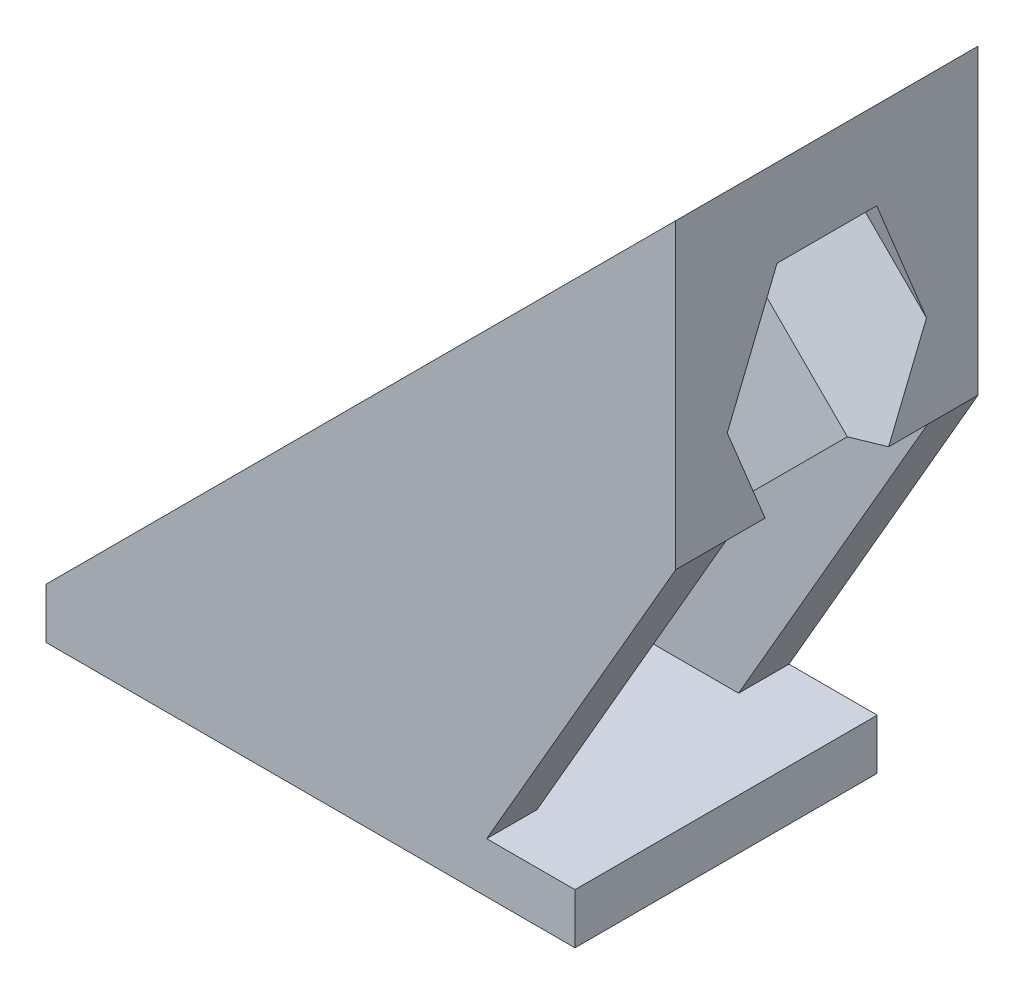
ISO-10303-21;
HEADER;
FILE_DESCRIPTION(('STEP AP214'),'2;1');
FILE_NAME('part.step','',(''),(''),'','','');
FILE_SCHEMA(('AUTOMOTIVE_DESIGN { 1 0 10303 214 1 1 1 1 }'));
ENDSEC;
DATA;
#1=APPLICATION_CONTEXT('core data for automotive mechanical design processes');
#2=APPLICATION_PROTOCOL_DEFINITION('international standard','automotive_design',2000,#1);
#3=PRODUCT_CONTEXT('',#1,'mechanical');
#4=PRODUCT('Part','Part','',(#3));
#5=PRODUCT_RELATED_PRODUCT_CATEGORY('part','',(#4));
#6=PRODUCT_DEFINITION_FORMATION('','',#4);
#7=PRODUCT_DEFINITION_CONTEXT('part definition',#1,'design');
#8=PRODUCT_DEFINITION('design','',#6,#7);
#9=PRODUCT_DEFINITION_SHAPE('','',#8);
#10=(LENGTH_UNIT() NAMED_UNIT(*) SI_UNIT(.MILLI.,.METRE.));
#11=(NAMED_UNIT(*) PLANE_ANGLE_UNIT() SI_UNIT($,.RADIAN.));
#12=(NAMED_UNIT(*) SI_UNIT($,.STERADIAN.) SOLID_ANGLE_UNIT());
#13=UNCERTAINTY_MEASURE_WITH_UNIT(LENGTH_MEASURE(1.E-05),#10,'distance_accuracy_value','');
#14=(GEOMETRIC_REPRESENTATION_CONTEXT(3) GLOBAL_UNCERTAINTY_ASSIGNED_CONTEXT((#13)) GLOBAL_UNIT_ASSIGNED_CONTEXT((#10,
#11,#12)) REPRESENTATION_CONTEXT('',''));
#15=CARTESIAN_POINT('',(0.,0.,0.));
#16=DIRECTION('',(0.,0.,1.));
#17=DIRECTION('',(1.,0.,0.));
#18=AXIS2_PLACEMENT_3D('',#15,#16,#17);
#19=CARTESIAN_POINT('',(0.,-2.,12.));
#20=DIRECTION('',(0.,1.,0.));
#21=DIRECTION('',(0.,0.,1.));
#22=AXIS2_PLACEMENT_3D('',#19,#20,#21);
#23=PLANE('',#22);
#24=CARTESIAN_POINT('',(10.2472232502674,-2.,6.));
#25=DIRECTION('',(0.,1.,0.));
#26=DIRECTION('',(0.,0.,1.));
#27=AXIS2_PLACEMENT_3D('',#24,#25,#26);
#28=CIRCLE('',#27,2.7);
#29=CARTESIAN_POINT('',(10.2472232502674,-2.,8.7));
#30=VERTEX_POINT('',#29);
#31=EDGE_CURVE('E228',#30,#30,#28,.T.);
#32=ORIENTED_EDGE('',*,*,#31,.T.);
#33=EDGE_LOOP('',(#32));
#34=FACE_BOUND('',#33,.T.);
#35=DIRECTION('',(1.,0.,0.));
#36=VECTOR('',#35,1.);
#37=CARTESIAN_POINT('',(0.,-2.,0.));
#38=LINE('',#37,#36);
#39=CARTESIAN_POINT('',(0.,-2.,0.));
#40=VERTEX_POINT('',#39);
#41=CARTESIAN_POINT('',(21.,-2.,0.));
#42=VERTEX_POINT('',#41);
#43=EDGE_CURVE('E241',#40,#42,#38,.T.);
#44=ORIENTED_EDGE('',*,*,#43,.T.);
#45=DIRECTION('',(0.,0.,-1.));
#46=VECTOR('',#45,1.);
#47=CARTESIAN_POINT('',(21.,-2.,12.));
#48=LINE('',#47,#46);
#49=CARTESIAN_POINT('',(21.,-2.,12.));
#50=VERTEX_POINT('',#49);
#51=EDGE_CURVE('E297',#50,#42,#48,.T.);
#52=ORIENTED_EDGE('',*,*,#51,.F.);
#53=DIRECTION('',(1.,0.,0.));
#54=VECTOR('',#53,1.);
#55=CARTESIAN_POINT('',(0.,-2.,12.));
#56=LINE('',#55,#54);
#57=CARTESIAN_POINT('',(0.,-2.,12.));
#58=VERTEX_POINT('',#57);
#59=EDGE_CURVE('E246',#58,#50,#56,.T.);
#60=ORIENTED_EDGE('',*,*,#59,.F.);
#61=DIRECTION('',(0.,0.,-1.));
#62=VECTOR('',#61,1.);
#63=CARTESIAN_POINT('',(0.,-2.,12.));
#64=LINE('',#63,#62);
#65=EDGE_CURVE('E268',#58,#40,#64,.T.);
#66=ORIENTED_EDGE('',*,*,#65,.T.);
#67=EDGE_LOOP('',(#44,#52,#60,#66));
#68=FACE_BOUND('',#67,.T.);
#69=ADVANCED_FACE('F44',(#34,#68),#23,.F.);
#70=CARTESIAN_POINT('',(20.,13.0000000000001,2.));
#71=DIRECTION('',(-0.607450107570799,0.794357832977195,0.));
#72=DIRECTION('',(-0.794357832977195,-0.607450107570799,0.));
#73=AXIS2_PLACEMENT_3D('',#70,#71,#72);
#74=PLANE('',#73);
#75=DIRECTION('',(-0.794357832977195,-0.607450107570799,0.));
#76=VECTOR('',#75,1.);
#77=CARTESIAN_POINT('',(20.,13.0000000000001,2.));
#78=LINE('',#77,#76);
#79=CARTESIAN_POINT('',(17.310833200471,10.943578329772,2.));
#80=VERTEX_POINT('',#79);
#81=CARTESIAN_POINT('',(2.99999999999997,0.,2.));
#82=VERTEX_POINT('',#81);
#83=EDGE_CURVE('E332',#80,#82,#78,.T.);
#84=ORIENTED_EDGE('',*,*,#83,.F.);
#85=DIRECTION('',(0.,0.,1.));
#86=VECTOR('',#85,1.);
#87=CARTESIAN_POINT('',(17.310833200471,10.943578329772,10.));
#88=LINE('',#87,#86);
#89=CARTESIAN_POINT('',(17.310833200471,10.943578329772,10.));
#90=VERTEX_POINT('',#89);
#91=EDGE_CURVE('E322',#80,#90,#88,.T.);
#92=ORIENTED_EDGE('',*,*,#91,.T.);
#93=DIRECTION('',(-0.794357832977195,-0.607450107570799,0.));
#94=VECTOR('',#93,1.);
#95=CARTESIAN_POINT('',(20.,13.0000000000001,10.));
#96=LINE('',#95,#94);
#97=CARTESIAN_POINT('',(2.99999999999997,0.,10.));
#98=VERTEX_POINT('',#97);
#99=EDGE_CURVE('E235',#90,#98,#96,.T.);
#100=ORIENTED_EDGE('',*,*,#99,.T.);
#101=DIRECTION('',(0.,0.,1.));
#102=VECTOR('',#101,1.);
#103=CARTESIAN_POINT('',(2.99999999999997,0.,2.));
#104=LINE('',#103,#102);
#105=EDGE_CURVE('E237',#82,#98,#104,.T.);
#106=ORIENTED_EDGE('',*,*,#105,.F.);
#107=EDGE_LOOP('',(#84,#92,#100,#106));
#108=FACE_BOUND('',#107,.T.);
#109=CARTESIAN_POINT('',(10.2472232502674,5.54199425020454,6.));
#110=DIRECTION('',(-0.607450107570799,0.794357832977195,0.));
#111=DIRECTION('',(-0.794357832977195,-0.607450107570799,0.));
#112=AXIS2_PLACEMENT_3D('',#109,#110,#111);
#113=ELLIPSE('',#112,6.29439251736257,5.);
#114=CARTESIAN_POINT('',(5.61538461538457,2.,7.88310139408547));
#115=VERTEX_POINT('',#114);
#116=CARTESIAN_POINT('',(5.61538461538457,2.,4.11689860591453));
#117=VERTEX_POINT('',#116);
#118=EDGE_CURVE('E365',#115,#117,#113,.F.);
#119=ORIENTED_EDGE('',*,*,#118,.F.);
#120=DIRECTION('',(0.,0.,-1.));
#121=VECTOR('',#120,1.);
#122=CARTESIAN_POINT('',(5.61538461538457,2.,2.));
#123=LINE('',#122,#121);
#124=EDGE_CURVE('E347',#115,#117,#123,.T.);
#125=ORIENTED_EDGE('',*,*,#124,.T.);
#126=EDGE_LOOP('',(#119,#125));
#127=FACE_BOUND('',#126,.T.);
#128=ADVANCED_FACE('F333',(#108,#127),#74,.F.);
#129=CARTESIAN_POINT('',(0.,0.,2.));
#130=DIRECTION('',(0.,0.,1.));
#131=DIRECTION('',(1.,0.,0.));
#132=AXIS2_PLACEMENT_3D('',#129,#130,#131);
#133=PLANE('',#132);
#134=DIRECTION('',(-1.,0.,0.));
#135=VECTOR('',#134,1.);
#136=CARTESIAN_POINT('',(25.,13.0000000000001,2.));
#137=LINE('',#136,#135);
#138=CARTESIAN_POINT('',(25.,13.0000000000001,2.));
#139=VERTEX_POINT('',#138);
#140=CARTESIAN_POINT('',(23.385334276179,13.0000000000001,2.));
#141=VERTEX_POINT('',#140);
#142=EDGE_CURVE('E405',#139,#141,#137,.T.);
#143=ORIENTED_EDGE('',*,*,#142,.T.);
#144=CARTESIAN_POINT('',(23.385334276179,3.00000000000009,2.));
#145=DIRECTION('',(0.,0.,1.));
#146=DIRECTION('',(1.,0.,0.));
#147=AXIS2_PLACEMENT_3D('',#144,#145,#146);
#148=CIRCLE('',#147,10.);
#149=EDGE_CURVE('E11',#141,#80,#148,.T.);
#150=ORIENTED_EDGE('',*,*,#149,.T.);
#151=ORIENTED_EDGE('',*,*,#83,.T.);
#152=DIRECTION('',(1.,0.,0.));
#153=VECTOR('',#152,1.);
#154=CARTESIAN_POINT('',(2.99999999999997,0.,2.));
#155=LINE('',#154,#153);
#156=CARTESIAN_POINT('',(7.24722325026741,0.,2.));
#157=VERTEX_POINT('',#156);
#158=EDGE_CURVE('E409',#82,#157,#155,.T.);
#159=ORIENTED_EDGE('',*,*,#158,.T.);
#160=DIRECTION('',(0.,-1.,0.));
#161=VECTOR('',#160,1.);
#162=CARTESIAN_POINT('',(7.24722325026741,2.,2.));
#163=LINE('',#162,#161);
#164=CARTESIAN_POINT('',(7.24722325026741,2.,2.));
#165=VERTEX_POINT('',#164);
#166=EDGE_CURVE('E359',#157,#165,#163,.F.);
#167=ORIENTED_EDGE('',*,*,#166,.T.);
#168=DIRECTION('',(-1.,0.,0.));
#169=VECTOR('',#168,1.);
#170=CARTESIAN_POINT('',(0.,2.,2.));
#171=LINE('',#170,#169);
#172=CARTESIAN_POINT('',(13.2472232502674,2.,2.));
#173=VERTEX_POINT('',#172);
#174=EDGE_CURVE('E349',#173,#165,#171,.T.);
#175=ORIENTED_EDGE('',*,*,#174,.F.);
#176=DIRECTION('',(0.,-1.,0.));
#177=VECTOR('',#176,1.);
#178=CARTESIAN_POINT('',(13.2472232502674,2.,2.));
#179=LINE('',#178,#177);
#180=CARTESIAN_POINT('',(13.2472232502674,0.,2.));
#181=VERTEX_POINT('',#180);
#182=EDGE_CURVE('E354',#173,#181,#179,.T.);
#183=ORIENTED_EDGE('',*,*,#182,.T.);
#184=CARTESIAN_POINT('',(17.4944465005349,0.,2.));
#185=VERTEX_POINT('',#184);
#186=EDGE_CURVE('E403',#181,#185,#155,.T.);
#187=ORIENTED_EDGE('',*,*,#186,.T.);
#188=DIRECTION('',(0.499999999999998,0.86602540378444,0.));
#189=VECTOR('',#188,1.);
#190=CARTESIAN_POINT('',(17.4944465005349,0.,2.));
#191=LINE('',#190,#189);
#192=EDGE_CURVE('E234',#185,#139,#191,.T.);
#193=ORIENTED_EDGE('',*,*,#192,.T.);
#194=EDGE_LOOP('',(#143,#150,#151,#159,#167,#175,#183,#187,#193));
#195=FACE_BOUND('',#194,.T.);
#196=ADVANCED_FACE('F411',(#195),#133,.T.);
#197=CARTESIAN_POINT('',(0.,0.,10.));
#198=DIRECTION('',(0.,0.,1.));
#199=DIRECTION('',(1.,0.,0.));
#200=AXIS2_PLACEMENT_3D('',#197,#198,#199);
#201=PLANE('',#200);
#202=ORIENTED_EDGE('',*,*,#99,.F.);
#203=CARTESIAN_POINT('',(23.385334276179,3.00000000000009,10.));
#204=DIRECTION('',(0.,0.,1.));
#205=DIRECTION('',(1.,0.,0.));
#206=AXIS2_PLACEMENT_3D('',#203,#204,#205);
#207=CIRCLE('',#206,10.);
#208=CARTESIAN_POINT('',(23.385334276179,13.0000000000001,10.));
#209=VERTEX_POINT('',#208);
#210=EDGE_CURVE('E66',#90,#209,#207,.F.);
#211=ORIENTED_EDGE('',*,*,#210,.T.);
#212=DIRECTION('',(-1.,0.,0.));
#213=VECTOR('',#212,1.);
#214=CARTESIAN_POINT('',(25.,13.0000000000001,10.));
#215=LINE('',#214,#213);
#216=CARTESIAN_POINT('',(25.,13.0000000000001,10.));
#217=VERTEX_POINT('',#216);
#218=EDGE_CURVE('E232',#217,#209,#215,.T.);
#219=ORIENTED_EDGE('',*,*,#218,.F.);
#220=DIRECTION('',(0.499999999999998,0.86602540378444,0.));
#221=VECTOR('',#220,1.);
#222=CARTESIAN_POINT('',(17.4944465005349,0.,10.));
#223=LINE('',#222,#221);
#224=CARTESIAN_POINT('',(17.4944465005349,0.,10.));
#225=VERTEX_POINT('',#224);
#226=EDGE_CURVE('E229',#225,#217,#223,.T.);
#227=ORIENTED_EDGE('',*,*,#226,.F.);
#228=DIRECTION('',(1.,0.,0.));
#229=VECTOR('',#228,1.);
#230=CARTESIAN_POINT('',(2.99999999999997,0.,10.));
#231=LINE('',#230,#229);
#232=CARTESIAN_POINT('',(13.2472232502674,0.,10.));
#233=VERTEX_POINT('',#232);
#234=EDGE_CURVE('E217',#233,#225,#231,.T.);
#235=ORIENTED_EDGE('',*,*,#234,.F.);
#236=DIRECTION('',(0.,-1.,0.));
#237=VECTOR('',#236,1.);
#238=CARTESIAN_POINT('',(13.2472232502674,2.,10.));
#239=LINE('',#238,#237);
#240=CARTESIAN_POINT('',(13.2472232502674,2.,10.));
#241=VERTEX_POINT('',#240);
#242=EDGE_CURVE('E204',#241,#233,#239,.T.);
#243=ORIENTED_EDGE('',*,*,#242,.F.);
#244=DIRECTION('',(-1.,0.,0.));
#245=VECTOR('',#244,1.);
#246=CARTESIAN_POINT('',(0.,2.,10.));
#247=LINE('',#246,#245);
#248=CARTESIAN_POINT('',(7.24722325026741,2.,10.));
#249=VERTEX_POINT('',#248);
#250=EDGE_CURVE('E212',#241,#249,#247,.T.);
#251=ORIENTED_EDGE('',*,*,#250,.T.);
#252=DIRECTION('',(0.,-1.,0.));
#253=VECTOR('',#252,1.);
#254=CARTESIAN_POINT('',(7.24722325026741,2.,10.));
#255=LINE('',#254,#253);
#256=CARTESIAN_POINT('',(7.24722325026741,0.,10.));
#257=VERTEX_POINT('',#256);
#258=EDGE_CURVE('E213',#257,#249,#255,.F.);
#259=ORIENTED_EDGE('',*,*,#258,.F.);
#260=EDGE_CURVE('E222',#98,#257,#231,.T.);
#261=ORIENTED_EDGE('',*,*,#260,.F.);
#262=EDGE_LOOP('',(#202,#211,#219,#227,#235,#243,#251,#259,#261));
#263=FACE_BOUND('',#262,.T.);
#264=ADVANCED_FACE('F226',(#263),#201,.F.);
#265=CARTESIAN_POINT('',(13.1208348754012,-7.57531754730546,12.));
#266=DIRECTION('',(0.86602540378444,-0.499999999999998,0.));
#267=DIRECTION('',(0.499999999999998,0.86602540378444,0.));
#268=AXIS2_PLACEMENT_3D('',#265,#266,#267);
#269=PLANE('',#268);
#270=DIRECTION('',(0.,0.,-1.));
#271=VECTOR('',#270,1.);
#272=CARTESIAN_POINT('',(17.4944465005349,0.,12.));
#273=LINE('',#272,#271);
#274=CARTESIAN_POINT('',(17.4944465005349,0.,12.));
#275=VERTEX_POINT('',#274);
#276=EDGE_CURVE('E298',#275,#225,#273,.T.);
#277=ORIENTED_EDGE('',*,*,#276,.T.);
#278=ORIENTED_EDGE('',*,*,#226,.T.);
#279=DIRECTION('',(0.,0.,-1.));
#280=VECTOR('',#279,1.);
#281=CARTESIAN_POINT('',(25.,13.0000000000001,12.));
#282=LINE('',#281,#280);
#283=CARTESIAN_POINT('',(25.,13.0000000000001,12.));
#284=VERTEX_POINT('',#283);
#285=EDGE_CURVE('E292',#284,#217,#282,.T.);
#286=ORIENTED_EDGE('',*,*,#285,.F.);
#287=DIRECTION('',(-0.499999999999998,-0.86602540378444,0.));
#288=VECTOR('',#287,1.);
#289=CARTESIAN_POINT('',(13.1208348754012,-7.57531754730546,12.));
#290=LINE('',#289,#288);
#291=EDGE_CURVE('E253',#284,#275,#290,.T.);
#292=ORIENTED_EDGE('',*,*,#291,.T.);
#293=EDGE_LOOP('',(#277,#278,#286,#292));
#294=FACE_BOUND('',#293,.T.);
#295=ADVANCED_FACE('F450',(#294),#269,.T.);
#296=CARTESIAN_POINT('',(21.,0.,12.));
#297=DIRECTION('',(-1.,0.,0.));
#298=DIRECTION('',(0.,0.,1.));
#299=AXIS2_PLACEMENT_3D('',#296,#297,#298);
#300=PLANE('',#299);
#301=DIRECTION('',(0.,1.,0.));
#302=VECTOR('',#301,1.);
#303=CARTESIAN_POINT('',(21.,0.,0.));
#304=LINE('',#303,#302);
#305=CARTESIAN_POINT('',(21.,0.,0.));
#306=VERTEX_POINT('',#305);
#307=EDGE_CURVE('E267',#42,#306,#304,.T.);
#308=ORIENTED_EDGE('',*,*,#307,.T.);
#309=DIRECTION('',(0.,0.,-1.));
#310=VECTOR('',#309,1.);
#311=CARTESIAN_POINT('',(21.,0.,12.));
#312=LINE('',#311,#310);
#313=CARTESIAN_POINT('',(21.,0.,12.));
#314=VERTEX_POINT('',#313);
#315=EDGE_CURVE('E296',#314,#306,#312,.T.);
#316=ORIENTED_EDGE('',*,*,#315,.F.);
#317=DIRECTION('',(0.,1.,0.));
#318=VECTOR('',#317,1.);
#319=CARTESIAN_POINT('',(21.,0.,12.));
#320=LINE('',#319,#318);
#321=EDGE_CURVE('E248',#50,#314,#320,.T.);
#322=ORIENTED_EDGE('',*,*,#321,.F.);
#323=ORIENTED_EDGE('',*,*,#51,.T.);
#324=EDGE_LOOP('',(#308,#316,#322,#323));
#325=FACE_BOUND('',#324,.T.);
#326=ADVANCED_FACE('F459',(#325),#300,.F.);
#327=CARTESIAN_POINT('',(0.,0.,12.));
#328=DIRECTION('',(0.,1.,0.));
#329=DIRECTION('',(0.,0.,1.));
#330=AXIS2_PLACEMENT_3D('',#327,#328,#329);
#331=PLANE('',#330);
#332=CARTESIAN_POINT('',(10.2472232502674,0.,6.));
#333=DIRECTION('',(0.,1.,0.));
#334=DIRECTION('',(0.,0.,1.));
#335=AXIS2_PLACEMENT_3D('',#332,#333,#334);
#336=CIRCLE('',#335,4.7);
#337=CARTESIAN_POINT('',(10.2472232502674,0.,10.7));
#338=VERTEX_POINT('',#337);
#339=EDGE_CURVE('E566',#338,#338,#336,.T.);
#340=ORIENTED_EDGE('',*,*,#339,.F.);
#341=EDGE_LOOP('',(#340));
#342=FACE_BOUND('',#341,.T.);
#343=ORIENTED_EDGE('',*,*,#260,.T.);
#344=CARTESIAN_POINT('',(10.2472232502674,0.,6.));
#345=DIRECTION('',(0.,1.,0.));
#346=DIRECTION('',(0.,0.,1.));
#347=AXIS2_PLACEMENT_3D('',#344,#345,#346);
#348=CIRCLE('',#347,5.);
#349=EDGE_CURVE('E209',#257,#233,#348,.T.);
#350=ORIENTED_EDGE('',*,*,#349,.T.);
#351=ORIENTED_EDGE('',*,*,#234,.T.);
#352=ORIENTED_EDGE('',*,*,#276,.F.);
#353=DIRECTION('',(1.,0.,0.));
#354=VECTOR('',#353,1.);
#355=CARTESIAN_POINT('',(0.,0.,12.));
#356=LINE('',#355,#354);
#357=EDGE_CURVE('E255',#275,#314,#356,.T.);
#358=ORIENTED_EDGE('',*,*,#357,.T.);
#359=ORIENTED_EDGE('',*,*,#315,.T.);
#360=DIRECTION('',(1.,0.,0.));
#361=VECTOR('',#360,1.);
#362=CARTESIAN_POINT('',(0.,0.,0.));
#363=LINE('',#362,#361);
#364=CARTESIAN_POINT('',(17.4944465005349,0.,0.));
#365=VERTEX_POINT('',#364);
#366=EDGE_CURVE('E275',#365,#306,#363,.T.);
#367=ORIENTED_EDGE('',*,*,#366,.F.);
#368=EDGE_CURVE('E294',#185,#365,#273,.T.);
#369=ORIENTED_EDGE('',*,*,#368,.F.);
#370=ORIENTED_EDGE('',*,*,#186,.F.);
#371=EDGE_CURVE('E224',#181,#157,#348,.T.);
#372=ORIENTED_EDGE('',*,*,#371,.T.);
#373=ORIENTED_EDGE('',*,*,#158,.F.);
#374=ORIENTED_EDGE('',*,*,#105,.T.);
#375=EDGE_LOOP('',(#343,#350,#351,#352,#358,#359,#367,#369,#370,#372,#373,#374));
#376=FACE_BOUND('',#375,.T.);
#377=ADVANCED_FACE('F218',(#342,#376),#331,.T.);
#378=ORIENTED_EDGE('',*,*,#192,.F.);
#379=ORIENTED_EDGE('',*,*,#368,.T.);
#380=DIRECTION('',(-0.499999999999998,-0.86602540378444,0.));
#381=VECTOR('',#380,1.);
#382=CARTESIAN_POINT('',(13.1208348754012,-7.57531754730546,0.));
#383=LINE('',#382,#381);
#384=CARTESIAN_POINT('',(25.,13.0000000000001,0.));
#385=VERTEX_POINT('',#384);
#386=EDGE_CURVE('E273',#385,#365,#383,.T.);
#387=ORIENTED_EDGE('',*,*,#386,.F.);
#388=EDGE_CURVE('E293',#139,#385,#282,.T.);
#389=ORIENTED_EDGE('',*,*,#388,.F.);
#390=EDGE_LOOP('',(#378,#379,#387,#389));
#391=FACE_BOUND('',#390,.T.);
#392=ADVANCED_FACE('F465',(#391),#269,.T.);
#393=CARTESIAN_POINT('',(25.,0.,12.));
#394=DIRECTION('',(1.,0.,0.));
#395=DIRECTION('',(0.,0.,-1.));
#396=AXIS2_PLACEMENT_3D('',#393,#394,#395);
#397=PLANE('',#396);
#398=DIRECTION('',(0.,0.925820099772551,-0.377964473009228));
#399=VECTOR('',#398,1.);
#400=CARTESIAN_POINT('',(25.,-1.10053652176836,9.30424707837012));
#401=LINE('',#400,#399);
#402=CARTESIAN_POINT('',(25.,13.0000000000001,3.54772714873487));
#403=VERTEX_POINT('',#402);
#404=CARTESIAN_POINT('',(25.,16.6805457065762,2.04515065605106));
#405=VERTEX_POINT('',#404);
#406=EDGE_CURVE('E396',#403,#405,#401,.T.);
#407=ORIENTED_EDGE('',*,*,#406,.F.);
#408=DIRECTION('',(0.,0.,1.));
#409=VECTOR('',#408,1.);
#410=CARTESIAN_POINT('',(25.,13.0000000000001,2.));
#411=LINE('',#410,#409);
#412=EDGE_CURVE('E245',#139,#403,#411,.T.);
#413=ORIENTED_EDGE('',*,*,#412,.F.);
#414=ORIENTED_EDGE('',*,*,#388,.T.);
#415=DIRECTION('',(0.,-1.,0.));
#416=VECTOR('',#415,1.);
#417=CARTESIAN_POINT('',(25.,0.,0.));
#418=LINE('',#417,#416);
#419=CARTESIAN_POINT('',(25.,25.0000000000001,0.));
#420=VERTEX_POINT('',#419);
#421=EDGE_CURVE('E280',#420,#385,#418,.T.);
#422=ORIENTED_EDGE('',*,*,#421,.F.);
#423=DIRECTION('',(0.,0.,-1.));
#424=VECTOR('',#423,1.);
#425=CARTESIAN_POINT('',(25.,25.0000000000001,12.));
#426=LINE('',#425,#424);
#427=CARTESIAN_POINT('',(25.,25.0000000000001,12.));
#428=VERTEX_POINT('',#427);
#429=EDGE_CURVE('E287',#428,#420,#426,.T.);
#430=ORIENTED_EDGE('',*,*,#429,.F.);
#431=DIRECTION('',(0.,-1.,0.));
#432=VECTOR('',#431,1.);
#433=CARTESIAN_POINT('',(25.,0.,12.));
#434=LINE('',#433,#432);
#435=EDGE_CURVE('E260',#428,#284,#434,.T.);
#436=ORIENTED_EDGE('',*,*,#435,.T.);
#437=ORIENTED_EDGE('',*,*,#285,.T.);
#438=CARTESIAN_POINT('',(25.,13.0000000000001,8.45227285126513));
#439=VERTEX_POINT('',#438);
#440=EDGE_CURVE('E244',#439,#217,#411,.T.);
#441=ORIENTED_EDGE('',*,*,#440,.F.);
#442=DIRECTION('',(0.,-0.925820099772551,-0.377964473009228));
#443=VECTOR('',#442,1.);
#444=CARTESIAN_POINT('',(25.,3.09858875157423,4.4100386359156));
#445=LINE('',#444,#443);
#446=CARTESIAN_POINT('',(25.,16.6805457065762,9.95484934394894));
#447=VERTEX_POINT('',#446);
#448=EDGE_CURVE('E386',#447,#439,#445,.T.);
#449=ORIENTED_EDGE('',*,*,#448,.F.);
#450=DIRECTION('',(0.,-0.925820099772551,0.377964473009228));
#451=VECTOR('',#450,1.);
#452=CARTESIAN_POINT('',(25.,1.66728145030469,16.083988810854));
#453=LINE('',#452,#451);
#454=CARTESIAN_POINT('',(25.,21.524227157704,7.97742467197447));
#455=VERTEX_POINT('',#454);
#456=EDGE_CURVE('E315',#455,#447,#453,.T.);
#457=ORIENTED_EDGE('',*,*,#456,.F.);
#458=DIRECTION('',(0.,0.,1.));
#459=VECTOR('',#458,1.);
#460=CARTESIAN_POINT('',(25.,21.524227157704,12.));
#461=LINE('',#460,#459);
#462=CARTESIAN_POINT('',(25.,21.524227157704,4.02257532802553));
#463=VERTEX_POINT('',#462);
#464=EDGE_CURVE('E313',#463,#455,#461,.T.);
#465=ORIENTED_EDGE('',*,*,#464,.F.);
#466=DIRECTION('',(0.,0.925820099772551,0.377964473009228));
#467=VECTOR('',#466,1.);
#468=CARTESIAN_POINT('',(25.,5.86640672364729,-2.36970309656829));
#469=LINE('',#468,#467);
#470=EDGE_CURVE('E317',#405,#463,#469,.T.);
#471=ORIENTED_EDGE('',*,*,#470,.F.);
#472=EDGE_LOOP('',(#407,#413,#414,#422,#430,#436,#437,#441,#449,#457,#465,#471));
#473=FACE_BOUND('',#472,.T.);
#474=ADVANCED_FACE('F416',(#473),#397,.T.);
#475=CARTESIAN_POINT('',(0.,0.,12.));
#476=DIRECTION('',(-0.707106781186549,0.707106781186546,0.));
#477=DIRECTION('',(-0.707106781186546,-0.707106781186549,0.));
#478=AXIS2_PLACEMENT_3D('',#475,#476,#477);
#479=PLANE('',#478);
#480=CARTESIAN_POINT('',(20.7573593128807,20.7573593128808,6.));
#481=DIRECTION('',(-0.707106781186549,0.707106781186547,0.));
#482=DIRECTION('',(-0.707106781186547,-0.707106781186549,0.));
#483=AXIS2_PLACEMENT_3D('',#480,#481,#482);
#484=CIRCLE('',#483,2.);
#485=CARTESIAN_POINT('',(19.3431457505076,19.3431457505077,6.));
#486=VERTEX_POINT('',#485);
#487=EDGE_CURVE('E321',#486,#486,#484,.T.);
#488=ORIENTED_EDGE('',*,*,#487,.F.);
#489=EDGE_LOOP('',(#488));
#490=FACE_BOUND('',#489,.T.);
#491=DIRECTION('',(0.707106781186546,0.707106781186549,0.));
#492=VECTOR('',#491,1.);
#493=CARTESIAN_POINT('',(0.,0.,0.));
#494=LINE('',#493,#492);
#495=CARTESIAN_POINT('',(0.,0.,0.));
#496=VERTEX_POINT('',#495);
#497=EDGE_CURVE('E284',#496,#420,#494,.T.);
#498=ORIENTED_EDGE('',*,*,#497,.F.);
#499=DIRECTION('',(0.,0.,-1.));
#500=VECTOR('',#499,1.);
#501=CARTESIAN_POINT('',(0.,0.,12.));
#502=LINE('',#501,#500);
#503=CARTESIAN_POINT('',(0.,0.,12.));
#504=VERTEX_POINT('',#503);
#505=EDGE_CURVE('E290',#504,#496,#502,.T.);
#506=ORIENTED_EDGE('',*,*,#505,.F.);
#507=DIRECTION('',(0.707106781186546,0.707106781186549,0.));
#508=VECTOR('',#507,1.);
#509=CARTESIAN_POINT('',(0.,0.,12.));
#510=LINE('',#509,#508);
#511=EDGE_CURVE('E264',#504,#428,#510,.T.);
#512=ORIENTED_EDGE('',*,*,#511,.T.);
#513=ORIENTED_EDGE('',*,*,#429,.T.);
#514=EDGE_LOOP('',(#498,#506,#512,#513));
#515=FACE_BOUND('',#514,.T.);
#516=ADVANCED_FACE('F498',(#490,#515),#479,.T.);
#517=CARTESIAN_POINT('',(0.,0.,12.));
#518=DIRECTION('',(1.,0.,0.));
#519=DIRECTION('',(0.,1.,0.));
#520=AXIS2_PLACEMENT_3D('',#517,#518,#519);
#521=PLANE('',#520);
#522=DIRECTION('',(0.,-1.,0.));
#523=VECTOR('',#522,1.);
#524=CARTESIAN_POINT('',(0.,0.,0.));
#525=LINE('',#524,#523);
#526=EDGE_CURVE('E249',#496,#40,#525,.T.);
#527=ORIENTED_EDGE('',*,*,#526,.T.);
#528=ORIENTED_EDGE('',*,*,#65,.F.);
#529=DIRECTION('',(0.,-1.,0.));
#530=VECTOR('',#529,1.);
#531=CARTESIAN_POINT('',(0.,0.,12.));
#532=LINE('',#531,#530);
#533=EDGE_CURVE('E263',#504,#58,#532,.T.);
#534=ORIENTED_EDGE('',*,*,#533,.F.);
#535=ORIENTED_EDGE('',*,*,#505,.T.);
#536=EDGE_LOOP('',(#527,#528,#534,#535));
#537=FACE_BOUND('',#536,.T.);
#538=ADVANCED_FACE('F501',(#537),#521,.F.);
#539=CARTESIAN_POINT('',(0.,0.,12.));
#540=DIRECTION('',(0.,0.,1.));
#541=DIRECTION('',(1.,0.,0.));
#542=AXIS2_PLACEMENT_3D('',#539,#540,#541);
#543=PLANE('',#542);
#544=ORIENTED_EDGE('',*,*,#59,.T.);
#545=ORIENTED_EDGE('',*,*,#321,.T.);
#546=ORIENTED_EDGE('',*,*,#357,.F.);
#547=ORIENTED_EDGE('',*,*,#291,.F.);
#548=ORIENTED_EDGE('',*,*,#435,.F.);
#549=ORIENTED_EDGE('',*,*,#511,.F.);
#550=ORIENTED_EDGE('',*,*,#533,.T.);
#551=EDGE_LOOP('',(#544,#545,#546,#547,#548,#549,#550));
#552=FACE_BOUND('',#551,.T.);
#553=ADVANCED_FACE('F448',(#552),#543,.T.);
#554=CARTESIAN_POINT('',(0.,0.,0.));
#555=DIRECTION('',(0.,0.,1.));
#556=DIRECTION('',(1.,0.,0.));
#557=AXIS2_PLACEMENT_3D('',#554,#555,#556);
#558=PLANE('',#557);
#559=ORIENTED_EDGE('',*,*,#43,.F.);
#560=ORIENTED_EDGE('',*,*,#526,.F.);
#561=ORIENTED_EDGE('',*,*,#497,.T.);
#562=ORIENTED_EDGE('',*,*,#421,.T.);
#563=ORIENTED_EDGE('',*,*,#386,.T.);
#564=ORIENTED_EDGE('',*,*,#366,.T.);
#565=ORIENTED_EDGE('',*,*,#307,.F.);
#566=EDGE_LOOP('',(#559,#560,#561,#562,#563,#564,#565));
#567=FACE_BOUND('',#566,.T.);
#568=ADVANCED_FACE('F457',(#567),#558,.F.);
#569=CARTESIAN_POINT('',(25.,13.0000000000001,2.));
#570=DIRECTION('',(0.,1.,0.));
#571=DIRECTION('',(-1.,0.,0.));
#572=AXIS2_PLACEMENT_3D('',#569,#570,#571);
#573=PLANE('',#572);
#574=ORIENTED_EDGE('',*,*,#218,.T.);
#575=DIRECTION('',(0.,0.,1.));
#576=VECTOR('',#575,1.);
#577=CARTESIAN_POINT('',(23.385334276179,13.0000000000001,2.));
#578=LINE('',#577,#576);
#579=EDGE_CURVE('E52',#209,#141,#578,.F.);
#580=ORIENTED_EDGE('',*,*,#579,.T.);
#581=ORIENTED_EDGE('',*,*,#142,.F.);
#582=ORIENTED_EDGE('',*,*,#412,.T.);
#583=DIRECTION('',(-0.925820099772552,0.,0.377964473009227));
#584=VECTOR('',#583,1.);
#585=CARTESIAN_POINT('',(25.5415916822076,13.0000000000001,3.32662327034418));
#586=LINE('',#585,#584);
#587=CARTESIAN_POINT('',(23.8368642554483,13.0000000000001,4.02257532802553));
#588=VERTEX_POINT('',#587);
#589=EDGE_CURVE('E307',#403,#588,#586,.T.);
#590=ORIENTED_EDGE('',*,*,#589,.T.);
#591=DIRECTION('',(0.,0.,1.));
#592=VECTOR('',#591,1.);
#593=CARTESIAN_POINT('',(23.8368642554483,13.0000000000001,2.));
#594=LINE('',#593,#592);
#595=CARTESIAN_POINT('',(23.8368642554483,13.0000000000001,7.97742467197447));
#596=VERTEX_POINT('',#595);
#597=EDGE_CURVE('E303',#588,#596,#594,.T.);
#598=ORIENTED_EDGE('',*,*,#597,.T.);
#599=DIRECTION('',(0.925820099772552,0.,0.377964473009227));
#600=VECTOR('',#599,1.);
#601=CARTESIAN_POINT('',(22.7421748333125,13.0000000000001,7.53051958679868));
#602=LINE('',#601,#600);
#603=EDGE_CURVE('E306',#596,#439,#602,.T.);
#604=ORIENTED_EDGE('',*,*,#603,.T.);
#605=ORIENTED_EDGE('',*,*,#440,.T.);
#606=EDGE_LOOP('',(#574,#580,#581,#582,#590,#598,#604,#605));
#607=FACE_BOUND('',#606,.T.);
#608=ADVANCED_FACE('F408',(#607),#573,.F.);
#609=CARTESIAN_POINT('',(31.9184321277242,4.9184321277242,0.));
#610=DIRECTION('',(-0.707106781186547,-0.707106781186548,0.));
#611=DIRECTION('',(0.707106781186548,-0.707106781186547,0.));
#612=AXIS2_PLACEMENT_3D('',#609,#610,#611);
#613=PLANE('',#612);
#614=DIRECTION('',(-0.707106781186548,0.707106781186547,0.));
#615=VECTOR('',#614,1.);
#616=CARTESIAN_POINT('',(31.9184321277242,4.9184321277242,4.02257532802553));
#617=LINE('',#616,#615);
#618=CARTESIAN_POINT('',(19.8326456900972,17.0042185653511,4.02257532802553));
#619=VERTEX_POINT('',#618);
#620=EDGE_CURVE('E381',#588,#619,#617,.T.);
#621=ORIENTED_EDGE('',*,*,#620,.T.);
#622=DIRECTION('',(0.,0.,1.));
#623=VECTOR('',#622,1.);
#624=CARTESIAN_POINT('',(19.8326456900972,17.0042185653511,0.));
#625=LINE('',#624,#623);
#626=CARTESIAN_POINT('',(19.8326456900972,17.0042185653511,7.97742467197447));
#627=VERTEX_POINT('',#626);
#628=EDGE_CURVE('E367',#619,#627,#625,.T.);
#629=ORIENTED_EDGE('',*,*,#628,.T.);
#630=DIRECTION('',(-0.707106781186548,0.707106781186547,0.));
#631=VECTOR('',#630,1.);
#632=CARTESIAN_POINT('',(31.9184321277242,4.9184321277242,7.97742467197447));
#633=LINE('',#632,#631);
#634=EDGE_CURVE('E393',#596,#627,#633,.T.);
#635=ORIENTED_EDGE('',*,*,#634,.F.);
#636=ORIENTED_EDGE('',*,*,#597,.F.);
#637=EDGE_LOOP('',(#621,#629,#635,#636));
#638=FACE_BOUND('',#637,.T.);
#639=ADVANCED_FACE('F437',(#638),#613,.F.);
#640=CARTESIAN_POINT('',(19.3362651576275,-7.66373484237255,14.2958716397713));
#641=DIRECTION('',(-0.353553390593273,-0.353553390593274,-0.866025403784439));
#642=DIRECTION('',(0.,0.925820099772551,-0.377964473009228));
#643=AXIS2_PLACEMENT_3D('',#640,#641,#642);
#644=PLANE('',#643);
#645=ORIENTED_EDGE('',*,*,#406,.T.);
#646=DIRECTION('',(-0.707106781186548,0.707106781186547,0.));
#647=VECTOR('',#646,1.);
#648=CARTESIAN_POINT('',(34.3402728532881,7.34027285328812,2.04515065605106));
#649=LINE('',#648,#647);
#650=CARTESIAN_POINT('',(22.2544864156612,19.426059290915,2.04515065605106));
#651=VERTEX_POINT('',#650);
#652=EDGE_CURVE('E383',#405,#651,#649,.T.);
#653=ORIENTED_EDGE('',*,*,#652,.T.);
#654=DIRECTION('',(-0.612372435695794,-0.612372435695795,0.5));
#655=VECTOR('',#654,1.);
#656=CARTESIAN_POINT('',(7.25047872000053,4.42205159525436,14.2958716397713));
#657=LINE('',#656,#655);
#658=EDGE_CURVE('E324',#651,#619,#657,.T.);
#659=ORIENTED_EDGE('',*,*,#658,.T.);
#660=ORIENTED_EDGE('',*,*,#620,.F.);
#661=ORIENTED_EDGE('',*,*,#589,.F.);
#662=EDGE_LOOP('',(#645,#653,#659,#660,#661));
#663=FACE_BOUND('',#662,.T.);
#664=ADVANCED_FACE('F424',(#663),#644,.F.);
#665=CARTESIAN_POINT('',(18.0838712690166,-8.91612873098339,-11.2281456556947));
#666=DIRECTION('',(0.353553390593273,0.353553390593274,-0.866025403784439));
#667=DIRECTION('',(0.,0.925820099772551,0.377964473009228));
#668=AXIS2_PLACEMENT_3D('',#665,#666,#667);
#669=PLANE('',#668);
#670=ORIENTED_EDGE('',*,*,#470,.T.);
#671=DIRECTION('',(-0.707106781186548,0.707106781186547,0.));
#672=VECTOR('',#671,1.);
#673=CARTESIAN_POINT('',(36.762113578852,9.76211357885205,4.02257532802553));
#674=LINE('',#673,#672);
#675=CARTESIAN_POINT('',(24.6763271412251,21.847900016479,4.02257532802553));
#676=VERTEX_POINT('',#675);
#677=EDGE_CURVE('E390',#463,#676,#674,.T.);
#678=ORIENTED_EDGE('',*,*,#677,.T.);
#679=DIRECTION('',(-0.612372435695794,-0.612372435695795,-0.5));
#680=VECTOR('',#679,1.);
#681=CARTESIAN_POINT('',(5.99808483138969,3.16965770664352,-11.2281456556947));
#682=LINE('',#681,#680);
#683=EDGE_CURVE('E382',#676,#651,#682,.T.);
#684=ORIENTED_EDGE('',*,*,#683,.T.);
#685=ORIENTED_EDGE('',*,*,#652,.F.);
#686=EDGE_LOOP('',(#670,#678,#684,#685));
#687=FACE_BOUND('',#686,.T.);
#688=ADVANCED_FACE('F429',(#687),#669,.F.);
#689=CARTESIAN_POINT('',(36.762113578852,9.76211357885205,0.));
#690=DIRECTION('',(0.707106781186547,0.707106781186548,0.));
#691=DIRECTION('',(-0.707106781186548,0.707106781186547,0.));
#692=AXIS2_PLACEMENT_3D('',#689,#690,#691);
#693=PLANE('',#692);
#694=ORIENTED_EDGE('',*,*,#464,.T.);
#695=DIRECTION('',(-0.707106781186548,0.707106781186547,0.));
#696=VECTOR('',#695,1.);
#697=CARTESIAN_POINT('',(36.762113578852,9.76211357885205,7.97742467197447));
#698=LINE('',#697,#696);
#699=CARTESIAN_POINT('',(24.6763271412251,21.847900016479,7.97742467197447));
#700=VERTEX_POINT('',#699);
#701=EDGE_CURVE('E387',#455,#700,#698,.T.);
#702=ORIENTED_EDGE('',*,*,#701,.T.);
#703=DIRECTION('',(0.,0.,-1.));
#704=VECTOR('',#703,1.);
#705=CARTESIAN_POINT('',(24.6763271412251,21.847900016479,0.));
#706=LINE('',#705,#704);
#707=EDGE_CURVE('E377',#700,#676,#706,.T.);
#708=ORIENTED_EDGE('',*,*,#707,.T.);
#709=ORIENTED_EDGE('',*,*,#677,.F.);
#710=EDGE_LOOP('',(#694,#702,#708,#709));
#711=FACE_BOUND('',#710,.T.);
#712=ADVANCED_FACE('F528',(#711),#693,.F.);
#713=CARTESIAN_POINT('',(21.7581058831914,-5.24189411680862,20.2281456556947));
#714=DIRECTION('',(0.353553390593273,0.353553390593274,0.866025403784439));
#715=DIRECTION('',(0.,-0.925820099772551,0.377964473009228));
#716=AXIS2_PLACEMENT_3D('',#713,#714,#715);
#717=PLANE('',#716);
#718=ORIENTED_EDGE('',*,*,#456,.T.);
#719=DIRECTION('',(-0.707106781186548,0.707106781186547,0.));
#720=VECTOR('',#719,1.);
#721=CARTESIAN_POINT('',(34.3402728532881,7.34027285328812,9.95484934394894));
#722=LINE('',#721,#720);
#723=CARTESIAN_POINT('',(22.2544864156612,19.426059290915,9.95484934394894));
#724=VERTEX_POINT('',#723);
#725=EDGE_CURVE('E391',#447,#724,#722,.T.);
#726=ORIENTED_EDGE('',*,*,#725,.T.);
#727=DIRECTION('',(0.612372435695794,0.612372435695795,-0.5));
#728=VECTOR('',#727,1.);
#729=CARTESIAN_POINT('',(9.67231944556445,6.84389232081829,20.2281456556947));
#730=LINE('',#729,#728);
#731=EDGE_CURVE('E374',#724,#700,#730,.T.);
#732=ORIENTED_EDGE('',*,*,#731,.T.);
#733=ORIENTED_EDGE('',*,*,#701,.F.);
#734=EDGE_LOOP('',(#718,#726,#732,#733));
#735=FACE_BOUND('',#734,.T.);
#736=ADVANCED_FACE('F525',(#735),#717,.F.);
#737=CARTESIAN_POINT('',(15.6620305434527,-11.3379694565473,-5.29587163977127));
#738=DIRECTION('',(-0.353553390593273,-0.353553390593274,0.866025403784438));
#739=DIRECTION('',(0.,-0.925820099772551,-0.377964473009228));
#740=AXIS2_PLACEMENT_3D('',#737,#738,#739);
#741=PLANE('',#740);
#742=ORIENTED_EDGE('',*,*,#448,.T.);
#743=ORIENTED_EDGE('',*,*,#603,.F.);
#744=ORIENTED_EDGE('',*,*,#634,.T.);
#745=DIRECTION('',(0.612372435695794,0.612372435695795,0.5));
#746=VECTOR('',#745,1.);
#747=CARTESIAN_POINT('',(3.57624410582577,0.747816981079587,-5.29587163977127));
#748=LINE('',#747,#746);
#749=EDGE_CURVE('E375',#627,#724,#748,.T.);
#750=ORIENTED_EDGE('',*,*,#749,.T.);
#751=ORIENTED_EDGE('',*,*,#725,.F.);
#752=EDGE_LOOP('',(#742,#743,#744,#750,#751));
#753=FACE_BOUND('',#752,.T.);
#754=ADVANCED_FACE('F517',(#753),#741,.F.);
#755=CARTESIAN_POINT('',(1.4142135623731,-1.41421356237309,0.));
#756=DIRECTION('',(-0.707106781186549,0.707106781186547,0.));
#757=DIRECTION('',(-0.707106781186547,-0.707106781186549,0.));
#758=AXIS2_PLACEMENT_3D('',#755,#756,#757);
#759=PLANE('',#758);
#760=CARTESIAN_POINT('',(22.1715728752538,19.3431457505077,6.));
#761=DIRECTION('',(-0.707106781186549,0.707106781186547,0.));
#762=DIRECTION('',(-0.707106781186547,-0.707106781186549,0.));
#763=AXIS2_PLACEMENT_3D('',#760,#761,#762);
#764=CIRCLE('',#763,2.);
#765=CARTESIAN_POINT('',(20.7573593128807,17.9289321881346,6.));
#766=VERTEX_POINT('',#765);
#767=EDGE_CURVE('E319',#766,#766,#764,.T.);
#768=ORIENTED_EDGE('',*,*,#767,.T.);
#769=EDGE_LOOP('',(#768));
#770=FACE_BOUND('',#769,.T.);
#771=ORIENTED_EDGE('',*,*,#658,.F.);
#772=ORIENTED_EDGE('',*,*,#683,.F.);
#773=ORIENTED_EDGE('',*,*,#707,.F.);
#774=ORIENTED_EDGE('',*,*,#731,.F.);
#775=ORIENTED_EDGE('',*,*,#749,.F.);
#776=ORIENTED_EDGE('',*,*,#628,.F.);
#777=EDGE_LOOP('',(#771,#772,#773,#774,#775,#776));
#778=FACE_BOUND('',#777,.T.);
#779=ADVANCED_FACE('F432',(#770,#778),#759,.F.);
#780=CARTESIAN_POINT('',(34.2573593128808,7.2573593128808,6.));
#781=DIRECTION('',(-0.707106781186548,0.707106781186547,0.));
#782=DIRECTION('',(-0.707106781186547,-0.707106781186548,0.));
#783=AXIS2_PLACEMENT_3D('',#780,#781,#782);
#784=CYLINDRICAL_SURFACE('',#783,2.);
#785=ORIENTED_EDGE('',*,*,#487,.T.);
#786=EDGE_LOOP('',(#785));
#787=FACE_BOUND('',#786,.T.);
#788=ORIENTED_EDGE('',*,*,#767,.F.);
#789=EDGE_LOOP('',(#788));
#790=FACE_BOUND('',#789,.T.);
#791=ADVANCED_FACE('F534',(#787,#790),#784,.F.);
#792=CARTESIAN_POINT('',(0.,2.,0.));
#793=DIRECTION('',(0.,1.,0.));
#794=DIRECTION('',(0.,0.,1.));
#795=AXIS2_PLACEMENT_3D('',#792,#793,#794);
#796=PLANE('',#795);
#797=CARTESIAN_POINT('',(10.2472232502674,2.,6.));
#798=DIRECTION('',(0.,1.,0.));
#799=DIRECTION('',(0.,0.,1.));
#800=AXIS2_PLACEMENT_3D('',#797,#798,#799);
#801=CIRCLE('',#800,5.);
#802=EDGE_CURVE('E214',#249,#241,#801,.T.);
#803=ORIENTED_EDGE('',*,*,#802,.F.);
#804=ORIENTED_EDGE('',*,*,#250,.F.);
#805=EDGE_LOOP('',(#803,#804));
#806=FACE_BOUND('',#805,.T.);
#807=ADVANCED_FACE('F336',(#806),#796,.F.);
#808=CARTESIAN_POINT('',(10.2472232502674,2.,6.));
#809=DIRECTION('',(0.,-1.,0.));
#810=DIRECTION('',(0.,0.,-1.));
#811=AXIS2_PLACEMENT_3D('',#808,#809,#810);
#812=CYLINDRICAL_SURFACE('',#811,5.);
#813=ORIENTED_EDGE('',*,*,#258,.T.);
#814=ORIENTED_EDGE('',*,*,#802,.T.);
#815=ORIENTED_EDGE('',*,*,#242,.T.);
#816=ORIENTED_EDGE('',*,*,#349,.F.);
#817=EDGE_LOOP('',(#813,#814,#815,#816));
#818=FACE_BOUND('',#817,.T.);
#819=ADVANCED_FACE('F206',(#818),#812,.F.);
#820=ORIENTED_EDGE('',*,*,#174,.T.);
#821=EDGE_CURVE('E344',#173,#165,#801,.T.);
#822=ORIENTED_EDGE('',*,*,#821,.F.);
#823=EDGE_LOOP('',(#820,#822));
#824=FACE_BOUND('',#823,.T.);
#825=ADVANCED_FACE('F466',(#824),#796,.F.);
#826=ORIENTED_EDGE('',*,*,#371,.F.);
#827=ORIENTED_EDGE('',*,*,#182,.F.);
#828=ORIENTED_EDGE('',*,*,#821,.T.);
#829=ORIENTED_EDGE('',*,*,#166,.F.);
#830=EDGE_LOOP('',(#826,#827,#828,#829));
#831=FACE_BOUND('',#830,.T.);
#832=ADVANCED_FACE('F464',(#831),#812,.F.);
#833=ORIENTED_EDGE('',*,*,#118,.T.);
#834=EDGE_CURVE('E339',#117,#115,#801,.T.);
#835=ORIENTED_EDGE('',*,*,#834,.T.);
#836=EDGE_LOOP('',(#833,#835));
#837=FACE_BOUND('',#836,.T.);
#838=ADVANCED_FACE('F470',(#837),#812,.F.);
#839=ORIENTED_EDGE('',*,*,#834,.F.);
#840=ORIENTED_EDGE('',*,*,#124,.F.);
#841=EDGE_LOOP('',(#839,#840));
#842=FACE_BOUND('',#841,.T.);
#843=ADVANCED_FACE('F473',(#842),#796,.F.);
#844=CARTESIAN_POINT('',(10.2472232502674,0.,6.));
#845=DIRECTION('',(0.,1.,0.));
#846=DIRECTION('',(0.,0.,1.));
#847=AXIS2_PLACEMENT_3D('',#844,#845,#846);
#848=CONICAL_SURFACE('',#847,4.7,0.785398163397448);
#849=ORIENTED_EDGE('',*,*,#339,.T.);
#850=EDGE_LOOP('',(#849));
#851=FACE_BOUND('',#850,.T.);
#852=ORIENTED_EDGE('',*,*,#31,.F.);
#853=EDGE_LOOP('',(#852));
#854=FACE_BOUND('',#853,.T.);
#855=ADVANCED_FACE('F551',(#851,#854),#848,.F.);
#856=CARTESIAN_POINT('',(23.385334276179,3.00000000000009,2.));
#857=DIRECTION('',(0.,0.,-1.));
#858=DIRECTION('',(-1.,0.,0.));
#859=AXIS2_PLACEMENT_3D('',#856,#857,#858);
#860=CYLINDRICAL_SURFACE('',#859,10.);
#861=ORIENTED_EDGE('',*,*,#149,.F.);
#862=ORIENTED_EDGE('',*,*,#579,.F.);
#863=ORIENTED_EDGE('',*,*,#210,.F.);
#864=ORIENTED_EDGE('',*,*,#91,.F.);
#865=EDGE_LOOP('',(#861,#862,#863,#864));
#866=FACE_BOUND('',#865,.T.);
#867=ADVANCED_FACE('F50',(#866),#860,.F.);
#868=CLOSED_SHELL('',(#69,#128,#196,#264,#295,#326,#377,#392,#474,#516,#538,#553,#568,#608,#639,
#664,#688,#712,#736,#754,#779,#791,#807,#819,#825,#832,#838,#843,#855,#867));
#869=MANIFOLD_SOLID_BREP('B2',#868);
#870=ADVANCED_BREP_SHAPE_REPRESENTATION('',(#18,#869),#14);
#871=SHAPE_DEFINITION_REPRESENTATION(#9,#870);
ENDSEC;
END-ISO-10303-21;
